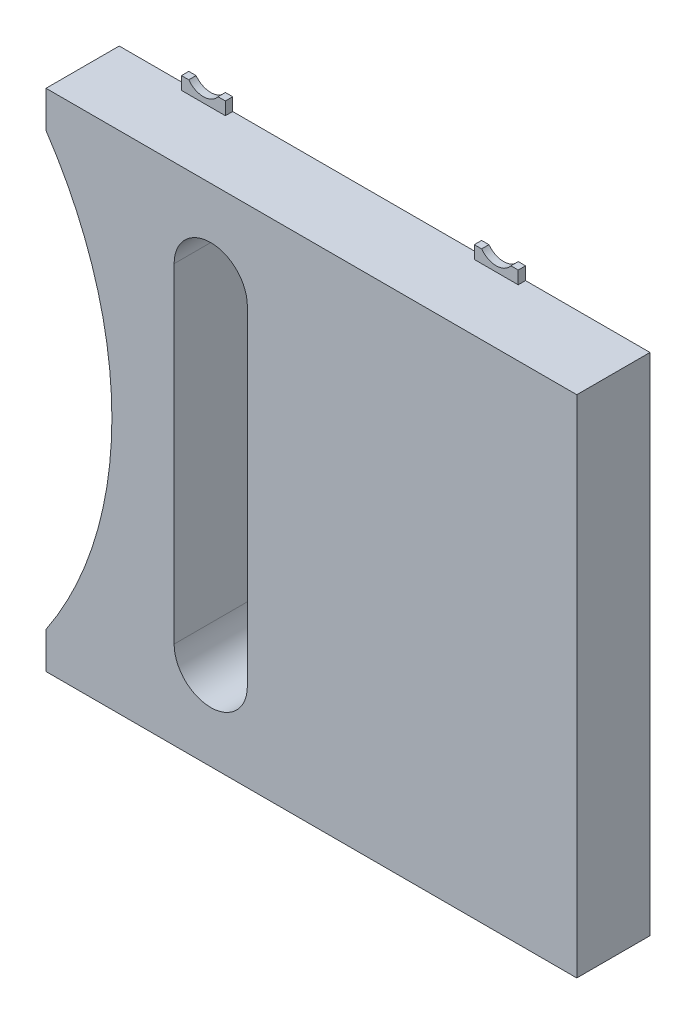
ISO-10303-21;
HEADER;
FILE_DESCRIPTION(('STEP AP214'),'2;1');
FILE_NAME('part.step','',(''),(''),'','','');
FILE_SCHEMA(('AUTOMOTIVE_DESIGN { 1 0 10303 214 1 1 1 1 }'));
ENDSEC;
DATA;
#1=APPLICATION_CONTEXT('core data for automotive mechanical design processes');
#2=APPLICATION_PROTOCOL_DEFINITION('international standard','automotive_design',2000,#1);
#3=PRODUCT_CONTEXT('',#1,'mechanical');
#4=PRODUCT('Part','Part','',(#3));
#5=PRODUCT_RELATED_PRODUCT_CATEGORY('part','',(#4));
#6=PRODUCT_DEFINITION_FORMATION('','',#4);
#7=PRODUCT_DEFINITION_CONTEXT('part definition',#1,'design');
#8=PRODUCT_DEFINITION('design','',#6,#7);
#9=PRODUCT_DEFINITION_SHAPE('','',#8);
#10=(LENGTH_UNIT() NAMED_UNIT(*) SI_UNIT(.MILLI.,.METRE.));
#11=(NAMED_UNIT(*) PLANE_ANGLE_UNIT() SI_UNIT($,.RADIAN.));
#12=(NAMED_UNIT(*) SI_UNIT($,.STERADIAN.) SOLID_ANGLE_UNIT());
#13=UNCERTAINTY_MEASURE_WITH_UNIT(LENGTH_MEASURE(1.E-05),#10,'distance_accuracy_value','');
#14=(GEOMETRIC_REPRESENTATION_CONTEXT(3) GLOBAL_UNCERTAINTY_ASSIGNED_CONTEXT((#13)) GLOBAL_UNIT_ASSIGNED_CONTEXT((#10,
#11,#12)) REPRESENTATION_CONTEXT('',''));
#15=CARTESIAN_POINT('',(0.,0.,0.));
#16=DIRECTION('',(0.,0.,1.));
#17=DIRECTION('',(1.,0.,0.));
#18=AXIS2_PLACEMENT_3D('',#15,#16,#17);
#19=CARTESIAN_POINT('',(-7.25,-6.9,2.));
#20=DIRECTION('',(0.,1.,0.));
#21=DIRECTION('',(0.,0.,1.));
#22=AXIS2_PLACEMENT_3D('',#19,#20,#21);
#23=PLANE('',#22);
#24=DIRECTION('',(0.,0.,-1.));
#25=VECTOR('',#24,1.);
#26=CARTESIAN_POINT('',(-4.15,-6.9,0.2));
#27=LINE('',#26,#25);
#28=CARTESIAN_POINT('',(-4.15,-6.9,0.2));
#29=VERTEX_POINT('',#28);
#30=CARTESIAN_POINT('',(-4.15,-6.9,0.));
#31=VERTEX_POINT('',#30);
#32=EDGE_CURVE('E285',#29,#31,#27,.T.);
#33=ORIENTED_EDGE('',*,*,#32,.T.);
#34=DIRECTION('',(1.,0.,0.));
#35=VECTOR('',#34,1.);
#36=CARTESIAN_POINT('',(-7.25,-6.9,0.));
#37=LINE('',#36,#35);
#38=CARTESIAN_POINT('',(2.65,-6.9,0.));
#39=VERTEX_POINT('',#38);
#40=EDGE_CURVE('E475',#31,#39,#37,.T.);
#41=ORIENTED_EDGE('',*,*,#40,.T.);
#42=DIRECTION('',(0.,0.,-1.));
#43=VECTOR('',#42,1.);
#44=CARTESIAN_POINT('',(2.65,-6.9,0.2));
#45=LINE('',#44,#43);
#46=CARTESIAN_POINT('',(2.65,-6.9,0.2));
#47=VERTEX_POINT('',#46);
#48=EDGE_CURVE('E315',#47,#39,#45,.T.);
#49=ORIENTED_EDGE('',*,*,#48,.F.);
#50=DIRECTION('',(-1.,0.,0.));
#51=VECTOR('',#50,1.);
#52=CARTESIAN_POINT('',(3.85,-6.9,0.2));
#53=LINE('',#52,#51);
#54=CARTESIAN_POINT('',(3.85,-6.9,0.2));
#55=VERTEX_POINT('',#54);
#56=EDGE_CURVE('E297',#55,#47,#53,.T.);
#57=ORIENTED_EDGE('',*,*,#56,.F.);
#58=DIRECTION('',(0.,0.,-1.));
#59=VECTOR('',#58,1.);
#60=CARTESIAN_POINT('',(3.85,-6.9,0.2));
#61=LINE('',#60,#59);
#62=CARTESIAN_POINT('',(3.85,-6.9,0.));
#63=VERTEX_POINT('',#62);
#64=EDGE_CURVE('E318',#55,#63,#61,.T.);
#65=ORIENTED_EDGE('',*,*,#64,.T.);
#66=CARTESIAN_POINT('',(7.25,-6.9,0.));
#67=VERTEX_POINT('',#66);
#68=EDGE_CURVE('E473',#63,#67,#37,.T.);
#69=ORIENTED_EDGE('',*,*,#68,.T.);
#70=DIRECTION('',(0.,0.,-1.));
#71=VECTOR('',#70,1.);
#72=CARTESIAN_POINT('',(7.25,-6.9,2.));
#73=LINE('',#72,#71);
#74=CARTESIAN_POINT('',(7.25,-6.9,2.));
#75=VERTEX_POINT('',#74);
#76=EDGE_CURVE('E460',#75,#67,#73,.T.);
#77=ORIENTED_EDGE('',*,*,#76,.F.);
#78=DIRECTION('',(1.,0.,0.));
#79=VECTOR('',#78,1.);
#80=CARTESIAN_POINT('',(-7.25,-6.9,2.));
#81=LINE('',#80,#79);
#82=CARTESIAN_POINT('',(-7.25,-6.9,2.));
#83=VERTEX_POINT('',#82);
#84=EDGE_CURVE('E458',#83,#75,#81,.T.);
#85=ORIENTED_EDGE('',*,*,#84,.F.);
#86=DIRECTION('',(0.,0.,-1.));
#87=VECTOR('',#86,1.);
#88=CARTESIAN_POINT('',(-7.25,-6.9,2.));
#89=LINE('',#88,#87);
#90=CARTESIAN_POINT('',(-7.25,-6.9,0.));
#91=VERTEX_POINT('',#90);
#92=EDGE_CURVE('E478',#83,#91,#89,.T.);
#93=ORIENTED_EDGE('',*,*,#92,.T.);
#94=CARTESIAN_POINT('',(-5.35,-6.9,0.));
#95=VERTEX_POINT('',#94);
#96=EDGE_CURVE('E450',#91,#95,#37,.T.);
#97=ORIENTED_EDGE('',*,*,#96,.T.);
#98=DIRECTION('',(0.,0.,-1.));
#99=VECTOR('',#98,1.);
#100=CARTESIAN_POINT('',(-5.35,-6.9,0.2));
#101=LINE('',#100,#99);
#102=CARTESIAN_POINT('',(-5.35,-6.9,0.2));
#103=VERTEX_POINT('',#102);
#104=EDGE_CURVE('E50',#103,#95,#101,.T.);
#105=ORIENTED_EDGE('',*,*,#104,.F.);
#106=DIRECTION('',(-1.,0.,0.));
#107=VECTOR('',#106,1.);
#108=CARTESIAN_POINT('',(-5.35,-6.9,0.2));
#109=LINE('',#108,#107);
#110=EDGE_CURVE('E54',#29,#103,#109,.T.);
#111=ORIENTED_EDGE('',*,*,#110,.F.);
#112=EDGE_LOOP('',(#33,#41,#49,#57,#65,#69,#77,#85,#93,#97,#105,#111));
#113=FACE_BOUND('',#112,.T.);
#114=ADVANCED_FACE('F35',(#113),#23,.F.);
#115=CARTESIAN_POINT('',(-7.25,6.9,2.));
#116=DIRECTION('',(0.,-1.,0.));
#117=DIRECTION('',(0.,0.,-1.));
#118=AXIS2_PLACEMENT_3D('',#115,#116,#117);
#119=PLANE('',#118);
#120=DIRECTION('',(0.,0.,-1.));
#121=VECTOR('',#120,1.);
#122=CARTESIAN_POINT('',(2.65,6.9,0.2));
#123=LINE('',#122,#121);
#124=CARTESIAN_POINT('',(2.65,6.9,0.2));
#125=VERTEX_POINT('',#124);
#126=CARTESIAN_POINT('',(2.65,6.9,0.));
#127=VERTEX_POINT('',#126);
#128=EDGE_CURVE('E363',#125,#127,#123,.T.);
#129=ORIENTED_EDGE('',*,*,#128,.T.);
#130=DIRECTION('',(-1.,0.,0.));
#131=VECTOR('',#130,1.);
#132=CARTESIAN_POINT('',(-7.25,6.9,0.));
#133=LINE('',#132,#131);
#134=CARTESIAN_POINT('',(-4.15,6.9,0.));
#135=VERTEX_POINT('',#134);
#136=EDGE_CURVE('E467',#127,#135,#133,.T.);
#137=ORIENTED_EDGE('',*,*,#136,.T.);
#138=DIRECTION('',(0.,0.,-1.));
#139=VECTOR('',#138,1.);
#140=CARTESIAN_POINT('',(-4.15,6.9,0.2));
#141=LINE('',#140,#139);
#142=CARTESIAN_POINT('',(-4.15,6.9,0.2));
#143=VERTEX_POINT('',#142);
#144=EDGE_CURVE('E402',#143,#135,#141,.T.);
#145=ORIENTED_EDGE('',*,*,#144,.F.);
#146=DIRECTION('',(1.,0.,0.));
#147=VECTOR('',#146,1.);
#148=CARTESIAN_POINT('',(-5.35,6.9,0.2));
#149=LINE('',#148,#147);
#150=CARTESIAN_POINT('',(-5.35,6.9,0.2));
#151=VERTEX_POINT('',#150);
#152=EDGE_CURVE('E381',#151,#143,#149,.T.);
#153=ORIENTED_EDGE('',*,*,#152,.F.);
#154=DIRECTION('',(0.,0.,-1.));
#155=VECTOR('',#154,1.);
#156=CARTESIAN_POINT('',(-5.35,6.9,0.2));
#157=LINE('',#156,#155);
#158=CARTESIAN_POINT('',(-5.35,6.9,0.));
#159=VERTEX_POINT('',#158);
#160=EDGE_CURVE('E405',#151,#159,#157,.T.);
#161=ORIENTED_EDGE('',*,*,#160,.T.);
#162=CARTESIAN_POINT('',(-7.25,6.9,0.));
#163=VERTEX_POINT('',#162);
#164=EDGE_CURVE('E463',#159,#163,#133,.T.);
#165=ORIENTED_EDGE('',*,*,#164,.T.);
#166=DIRECTION('',(0.,0.,-1.));
#167=VECTOR('',#166,1.);
#168=CARTESIAN_POINT('',(-7.25,6.9,2.));
#169=LINE('',#168,#167);
#170=CARTESIAN_POINT('',(-7.25,6.9,2.));
#171=VERTEX_POINT('',#170);
#172=EDGE_CURVE('E43',#171,#163,#169,.T.);
#173=ORIENTED_EDGE('',*,*,#172,.F.);
#174=DIRECTION('',(-1.,0.,0.));
#175=VECTOR('',#174,1.);
#176=CARTESIAN_POINT('',(-7.25,6.9,2.));
#177=LINE('',#176,#175);
#178=CARTESIAN_POINT('',(7.25,6.9,2.));
#179=VERTEX_POINT('',#178);
#180=EDGE_CURVE('E449',#179,#171,#177,.T.);
#181=ORIENTED_EDGE('',*,*,#180,.F.);
#182=DIRECTION('',(0.,0.,-1.));
#183=VECTOR('',#182,1.);
#184=CARTESIAN_POINT('',(7.25,6.9,2.));
#185=LINE('',#184,#183);
#186=CARTESIAN_POINT('',(7.25,6.9,0.));
#187=VERTEX_POINT('',#186);
#188=EDGE_CURVE('E11',#179,#187,#185,.T.);
#189=ORIENTED_EDGE('',*,*,#188,.T.);
#190=CARTESIAN_POINT('',(3.85,6.9,0.));
#191=VERTEX_POINT('',#190);
#192=EDGE_CURVE('E464',#187,#191,#133,.T.);
#193=ORIENTED_EDGE('',*,*,#192,.T.);
#194=DIRECTION('',(0.,0.,-1.));
#195=VECTOR('',#194,1.);
#196=CARTESIAN_POINT('',(3.85,6.9,0.2));
#197=LINE('',#196,#195);
#198=CARTESIAN_POINT('',(3.85,6.9,0.2));
#199=VERTEX_POINT('',#198);
#200=EDGE_CURVE('E360',#199,#191,#197,.T.);
#201=ORIENTED_EDGE('',*,*,#200,.F.);
#202=DIRECTION('',(1.,0.,0.));
#203=VECTOR('',#202,1.);
#204=CARTESIAN_POINT('',(3.85,6.9,0.2));
#205=LINE('',#204,#203);
#206=EDGE_CURVE('E337',#125,#199,#205,.T.);
#207=ORIENTED_EDGE('',*,*,#206,.F.);
#208=EDGE_LOOP('',(#129,#137,#145,#153,#161,#165,#173,#181,#189,#193,#201,#207));
#209=FACE_BOUND('',#208,.T.);
#210=ADVANCED_FACE('F518',(#209),#119,.F.);
#211=CARTESIAN_POINT('',(-16.0194444444445,0.,2.));
#212=DIRECTION('',(0.,0.,-1.));
#213=DIRECTION('',(-1.,0.,0.));
#214=AXIS2_PLACEMENT_3D('',#211,#212,#213);
#215=PLANE('',#214);
#216=DIRECTION('',(0.,1.,0.));
#217=VECTOR('',#216,1.);
#218=CARTESIAN_POINT('',(7.25,6.9,2.));
#219=LINE('',#218,#217);
#220=EDGE_CURVE('E446',#75,#179,#219,.T.);
#221=ORIENTED_EDGE('',*,*,#220,.T.);
#222=ORIENTED_EDGE('',*,*,#180,.T.);
#223=DIRECTION('',(0.,-1.,0.));
#224=VECTOR('',#223,1.);
#225=CARTESIAN_POINT('',(-7.25,6.9,2.));
#226=LINE('',#225,#224);
#227=CARTESIAN_POINT('',(-7.25,5.9,2.));
#228=VERTEX_POINT('',#227);
#229=EDGE_CURVE('E452',#171,#228,#226,.T.);
#230=ORIENTED_EDGE('',*,*,#229,.T.);
#231=CARTESIAN_POINT('',(-16.0194444444445,0.,2.));
#232=DIRECTION('',(0.,0.,-1.));
#233=DIRECTION('',(-1.,0.,0.));
#234=AXIS2_PLACEMENT_3D('',#231,#232,#233);
#235=CIRCLE('',#234,10.5694444444445);
#236=CARTESIAN_POINT('',(-7.25,-5.9,2.));
#237=VERTEX_POINT('',#236);
#238=EDGE_CURVE('E454',#228,#237,#235,.T.);
#239=ORIENTED_EDGE('',*,*,#238,.T.);
#240=DIRECTION('',(0.,-1.,0.));
#241=VECTOR('',#240,1.);
#242=CARTESIAN_POINT('',(-7.25,-6.9,2.));
#243=LINE('',#242,#241);
#244=EDGE_CURVE('E456',#237,#83,#243,.T.);
#245=ORIENTED_EDGE('',*,*,#244,.T.);
#246=ORIENTED_EDGE('',*,*,#84,.T.);
#247=EDGE_LOOP('',(#221,#222,#230,#239,#245,#246));
#248=FACE_BOUND('',#247,.T.);
#249=CARTESIAN_POINT('',(-2.75,-4.5,2.));
#250=DIRECTION('',(0.,0.,1.));
#251=DIRECTION('',(1.,0.,0.));
#252=AXIS2_PLACEMENT_3D('',#249,#250,#251);
#253=CIRCLE('',#252,1.);
#254=CARTESIAN_POINT('',(-3.75,-4.5,2.));
#255=VERTEX_POINT('',#254);
#256=CARTESIAN_POINT('',(-1.75,-4.5,2.));
#257=VERTEX_POINT('',#256);
#258=EDGE_CURVE('E415',#255,#257,#253,.T.);
#259=ORIENTED_EDGE('',*,*,#258,.F.);
#260=DIRECTION('',(0.,-1.,0.));
#261=VECTOR('',#260,1.);
#262=CARTESIAN_POINT('',(-3.75,-4.5,2.));
#263=LINE('',#262,#261);
#264=CARTESIAN_POINT('',(-3.75,4.5,2.));
#265=VERTEX_POINT('',#264);
#266=EDGE_CURVE('E423',#265,#255,#263,.T.);
#267=ORIENTED_EDGE('',*,*,#266,.F.);
#268=CARTESIAN_POINT('',(-2.75,4.5,2.));
#269=DIRECTION('',(0.,0.,1.));
#270=DIRECTION('',(1.,0.,0.));
#271=AXIS2_PLACEMENT_3D('',#268,#269,#270);
#272=CIRCLE('',#271,1.);
#273=CARTESIAN_POINT('',(-1.75,4.5,2.));
#274=VERTEX_POINT('',#273);
#275=EDGE_CURVE('E420',#274,#265,#272,.T.);
#276=ORIENTED_EDGE('',*,*,#275,.F.);
#277=DIRECTION('',(0.,1.,0.));
#278=VECTOR('',#277,1.);
#279=CARTESIAN_POINT('',(-1.75,-4.5,2.));
#280=LINE('',#279,#278);
#281=EDGE_CURVE('E417',#257,#274,#280,.T.);
#282=ORIENTED_EDGE('',*,*,#281,.F.);
#283=EDGE_LOOP('',(#259,#267,#276,#282));
#284=FACE_BOUND('',#283,.T.);
#285=ADVANCED_FACE('F513',(#248,#284),#215,.F.);
#286=CARTESIAN_POINT('',(-16.0194444444445,0.,0.));
#287=DIRECTION('',(0.,0.,-1.));
#288=DIRECTION('',(-1.,0.,0.));
#289=AXIS2_PLACEMENT_3D('',#286,#287,#288);
#290=PLANE('',#289);
#291=DIRECTION('',(0.,1.,0.));
#292=VECTOR('',#291,1.);
#293=CARTESIAN_POINT('',(7.25,6.9,0.));
#294=LINE('',#293,#292);
#295=EDGE_CURVE('E445',#67,#187,#294,.T.);
#296=ORIENTED_EDGE('',*,*,#295,.F.);
#297=ORIENTED_EDGE('',*,*,#68,.F.);
#298=DIRECTION('',(0.,1.,0.));
#299=VECTOR('',#298,1.);
#300=CARTESIAN_POINT('',(3.85,-7.25,0.));
#301=LINE('',#300,#299);
#302=CARTESIAN_POINT('',(3.85,-7.25,0.));
#303=VERTEX_POINT('',#302);
#304=EDGE_CURVE('E305',#303,#63,#301,.T.);
#305=ORIENTED_EDGE('',*,*,#304,.F.);
#306=DIRECTION('',(1.,0.,0.));
#307=VECTOR('',#306,1.);
#308=CARTESIAN_POINT('',(3.65,-7.25,0.));
#309=LINE('',#308,#307);
#310=CARTESIAN_POINT('',(3.65,-7.25,0.));
#311=VERTEX_POINT('',#310);
#312=EDGE_CURVE('E283',#311,#303,#309,.T.);
#313=ORIENTED_EDGE('',*,*,#312,.F.);
#314=CARTESIAN_POINT('',(3.25,-7.54999999999999,0.));
#315=DIRECTION('',(0.,0.,-1.));
#316=DIRECTION('',(1.,0.,0.));
#317=AXIS2_PLACEMENT_3D('',#314,#315,#316);
#318=CIRCLE('',#317,0.499999999999998);
#319=CARTESIAN_POINT('',(2.85,-7.25,0.));
#320=VERTEX_POINT('',#319);
#321=EDGE_CURVE('E280',#320,#311,#318,.T.);
#322=ORIENTED_EDGE('',*,*,#321,.F.);
#323=DIRECTION('',(1.,0.,0.));
#324=VECTOR('',#323,1.);
#325=CARTESIAN_POINT('',(2.65,-7.25,0.));
#326=LINE('',#325,#324);
#327=CARTESIAN_POINT('',(2.65,-7.25,0.));
#328=VERTEX_POINT('',#327);
#329=EDGE_CURVE('E293',#328,#320,#326,.T.);
#330=ORIENTED_EDGE('',*,*,#329,.F.);
#331=DIRECTION('',(0.,-1.,0.));
#332=VECTOR('',#331,1.);
#333=CARTESIAN_POINT('',(2.65,-6.9,0.));
#334=LINE('',#333,#332);
#335=EDGE_CURVE('E307',#39,#328,#334,.T.);
#336=ORIENTED_EDGE('',*,*,#335,.F.);
#337=ORIENTED_EDGE('',*,*,#40,.F.);
#338=DIRECTION('',(0.,1.,0.));
#339=VECTOR('',#338,1.);
#340=CARTESIAN_POINT('',(-4.15,-6.9,0.));
#341=LINE('',#340,#339);
#342=CARTESIAN_POINT('',(-4.15,-7.25,0.));
#343=VERTEX_POINT('',#342);
#344=EDGE_CURVE('E817',#343,#31,#341,.T.);
#345=ORIENTED_EDGE('',*,*,#344,.F.);
#346=DIRECTION('',(1.,0.,0.));
#347=VECTOR('',#346,1.);
#348=CARTESIAN_POINT('',(-4.15,-7.25,0.));
#349=LINE('',#348,#347);
#350=CARTESIAN_POINT('',(-4.35,-7.25,0.));
#351=VERTEX_POINT('',#350);
#352=EDGE_CURVE('E815',#351,#343,#349,.T.);
#353=ORIENTED_EDGE('',*,*,#352,.F.);
#354=CARTESIAN_POINT('',(-4.75,-7.54999999999999,0.));
#355=DIRECTION('',(0.,0.,-1.));
#356=DIRECTION('',(-1.,0.,0.));
#357=AXIS2_PLACEMENT_3D('',#354,#355,#356);
#358=CIRCLE('',#357,0.499999999999998);
#359=CARTESIAN_POINT('',(-5.15000000000001,-7.25,0.));
#360=VERTEX_POINT('',#359);
#361=EDGE_CURVE('E279',#360,#351,#358,.T.);
#362=ORIENTED_EDGE('',*,*,#361,.F.);
#363=DIRECTION('',(1.,0.,0.));
#364=VECTOR('',#363,1.);
#365=CARTESIAN_POINT('',(-5.15000000000001,-7.25,0.));
#366=LINE('',#365,#364);
#367=CARTESIAN_POINT('',(-5.35,-7.25,0.));
#368=VERTEX_POINT('',#367);
#369=EDGE_CURVE('E275',#368,#360,#366,.T.);
#370=ORIENTED_EDGE('',*,*,#369,.F.);
#371=DIRECTION('',(0.,-1.,0.));
#372=VECTOR('',#371,1.);
#373=CARTESIAN_POINT('',(-5.35,-7.25,0.));
#374=LINE('',#373,#372);
#375=EDGE_CURVE('E811',#95,#368,#374,.T.);
#376=ORIENTED_EDGE('',*,*,#375,.F.);
#377=ORIENTED_EDGE('',*,*,#96,.F.);
#378=DIRECTION('',(0.,-1.,0.));
#379=VECTOR('',#378,1.);
#380=CARTESIAN_POINT('',(-7.25,-6.9,0.));
#381=LINE('',#380,#379);
#382=CARTESIAN_POINT('',(-7.25,-5.9,0.));
#383=VERTEX_POINT('',#382);
#384=EDGE_CURVE('E471',#383,#91,#381,.T.);
#385=ORIENTED_EDGE('',*,*,#384,.F.);
#386=CARTESIAN_POINT('',(-16.0194444444445,0.,0.));
#387=DIRECTION('',(0.,0.,-1.));
#388=DIRECTION('',(-1.,0.,0.));
#389=AXIS2_PLACEMENT_3D('',#386,#387,#388);
#390=CIRCLE('',#389,10.5694444444445);
#391=CARTESIAN_POINT('',(-7.25,5.9,0.));
#392=VERTEX_POINT('',#391);
#393=EDGE_CURVE('E469',#392,#383,#390,.T.);
#394=ORIENTED_EDGE('',*,*,#393,.F.);
#395=DIRECTION('',(0.,-1.,0.));
#396=VECTOR('',#395,1.);
#397=CARTESIAN_POINT('',(-7.25,6.9,0.));
#398=LINE('',#397,#396);
#399=EDGE_CURVE('E466',#163,#392,#398,.T.);
#400=ORIENTED_EDGE('',*,*,#399,.F.);
#401=ORIENTED_EDGE('',*,*,#164,.F.);
#402=DIRECTION('',(0.,-1.,0.));
#403=VECTOR('',#402,1.);
#404=CARTESIAN_POINT('',(-5.35,7.25,0.));
#405=LINE('',#404,#403);
#406=CARTESIAN_POINT('',(-5.35,7.25,0.));
#407=VERTEX_POINT('',#406);
#408=EDGE_CURVE('E392',#407,#159,#405,.T.);
#409=ORIENTED_EDGE('',*,*,#408,.F.);
#410=DIRECTION('',(-1.,0.,0.));
#411=VECTOR('',#410,1.);
#412=CARTESIAN_POINT('',(-5.15,7.25,0.));
#413=LINE('',#412,#411);
#414=CARTESIAN_POINT('',(-5.15,7.25,0.));
#415=VERTEX_POINT('',#414);
#416=EDGE_CURVE('E390',#415,#407,#413,.T.);
#417=ORIENTED_EDGE('',*,*,#416,.F.);
#418=CARTESIAN_POINT('',(-4.75,7.54999999999999,0.));
#419=DIRECTION('',(0.,0.,-1.));
#420=DIRECTION('',(1.,0.,0.));
#421=AXIS2_PLACEMENT_3D('',#418,#419,#420);
#422=CIRCLE('',#421,0.499999999999995);
#423=CARTESIAN_POINT('',(-4.35,7.25,0.));
#424=VERTEX_POINT('',#423);
#425=EDGE_CURVE('E372',#424,#415,#422,.T.);
#426=ORIENTED_EDGE('',*,*,#425,.F.);
#427=DIRECTION('',(-1.,0.,0.));
#428=VECTOR('',#427,1.);
#429=CARTESIAN_POINT('',(-4.15,7.25,0.));
#430=LINE('',#429,#428);
#431=CARTESIAN_POINT('',(-4.15,7.25,0.));
#432=VERTEX_POINT('',#431);
#433=EDGE_CURVE('E377',#432,#424,#430,.T.);
#434=ORIENTED_EDGE('',*,*,#433,.F.);
#435=DIRECTION('',(0.,1.,0.));
#436=VECTOR('',#435,1.);
#437=CARTESIAN_POINT('',(-4.15,6.9,0.));
#438=LINE('',#437,#436);
#439=EDGE_CURVE('E394',#135,#432,#438,.T.);
#440=ORIENTED_EDGE('',*,*,#439,.F.);
#441=ORIENTED_EDGE('',*,*,#136,.F.);
#442=DIRECTION('',(0.,-1.,0.));
#443=VECTOR('',#442,1.);
#444=CARTESIAN_POINT('',(2.65,6.9,0.));
#445=LINE('',#444,#443);
#446=CARTESIAN_POINT('',(2.65,7.25,0.));
#447=VERTEX_POINT('',#446);
#448=EDGE_CURVE('E349',#447,#127,#445,.T.);
#449=ORIENTED_EDGE('',*,*,#448,.F.);
#450=DIRECTION('',(-1.,0.,0.));
#451=VECTOR('',#450,1.);
#452=CARTESIAN_POINT('',(2.65,7.25,0.));
#453=LINE('',#452,#451);
#454=CARTESIAN_POINT('',(2.85,7.25,0.));
#455=VERTEX_POINT('',#454);
#456=EDGE_CURVE('E347',#455,#447,#453,.T.);
#457=ORIENTED_EDGE('',*,*,#456,.F.);
#458=CARTESIAN_POINT('',(3.25,7.54999999999999,0.));
#459=DIRECTION('',(0.,0.,-1.));
#460=DIRECTION('',(-1.,0.,0.));
#461=AXIS2_PLACEMENT_3D('',#458,#459,#460);
#462=CIRCLE('',#461,0.499999999999995);
#463=CARTESIAN_POINT('',(3.65,7.25,0.));
#464=VERTEX_POINT('',#463);
#465=EDGE_CURVE('E327',#464,#455,#462,.T.);
#466=ORIENTED_EDGE('',*,*,#465,.F.);
#467=DIRECTION('',(-1.,0.,0.));
#468=VECTOR('',#467,1.);
#469=CARTESIAN_POINT('',(3.65,7.25,0.));
#470=LINE('',#469,#468);
#471=CARTESIAN_POINT('',(3.85,7.25,0.));
#472=VERTEX_POINT('',#471);
#473=EDGE_CURVE('E332',#472,#464,#470,.T.);
#474=ORIENTED_EDGE('',*,*,#473,.F.);
#475=DIRECTION('',(0.,1.,0.));
#476=VECTOR('',#475,1.);
#477=CARTESIAN_POINT('',(3.85,7.25,0.));
#478=LINE('',#477,#476);
#479=EDGE_CURVE('E352',#191,#472,#478,.T.);
#480=ORIENTED_EDGE('',*,*,#479,.F.);
#481=ORIENTED_EDGE('',*,*,#192,.F.);
#482=EDGE_LOOP('',(#296,#297,#305,#313,#322,#330,#336,#337,#345,#353,#362,#370,#376,#377,#385,
#394,#400,#401,#409,#417,#426,#434,#440,#441,#449,#457,#466,#474,#480,#481));
#483=FACE_BOUND('',#482,.T.);
#484=DIRECTION('',(0.,-1.,0.));
#485=VECTOR('',#484,1.);
#486=CARTESIAN_POINT('',(-3.75,-4.5,0.));
#487=LINE('',#486,#485);
#488=CARTESIAN_POINT('',(-3.75,4.5,0.));
#489=VERTEX_POINT('',#488);
#490=CARTESIAN_POINT('',(-3.75,-4.5,0.));
#491=VERTEX_POINT('',#490);
#492=EDGE_CURVE('E418',#489,#491,#487,.T.);
#493=ORIENTED_EDGE('',*,*,#492,.T.);
#494=CARTESIAN_POINT('',(-2.75,-4.5,0.));
#495=DIRECTION('',(0.,0.,1.));
#496=DIRECTION('',(1.,0.,0.));
#497=AXIS2_PLACEMENT_3D('',#494,#495,#496);
#498=CIRCLE('',#497,1.);
#499=CARTESIAN_POINT('',(-1.75,-4.5,0.));
#500=VERTEX_POINT('',#499);
#501=EDGE_CURVE('E414',#491,#500,#498,.T.);
#502=ORIENTED_EDGE('',*,*,#501,.T.);
#503=DIRECTION('',(0.,1.,0.));
#504=VECTOR('',#503,1.);
#505=CARTESIAN_POINT('',(-1.75,-4.5,0.));
#506=LINE('',#505,#504);
#507=CARTESIAN_POINT('',(-1.75,4.5,0.));
#508=VERTEX_POINT('',#507);
#509=EDGE_CURVE('E428',#500,#508,#506,.T.);
#510=ORIENTED_EDGE('',*,*,#509,.T.);
#511=CARTESIAN_POINT('',(-2.75,4.5,0.));
#512=DIRECTION('',(0.,0.,1.));
#513=DIRECTION('',(1.,0.,0.));
#514=AXIS2_PLACEMENT_3D('',#511,#512,#513);
#515=CIRCLE('',#514,1.);
#516=EDGE_CURVE('E431',#508,#489,#515,.T.);
#517=ORIENTED_EDGE('',*,*,#516,.T.);
#518=EDGE_LOOP('',(#493,#502,#510,#517));
#519=FACE_BOUND('',#518,.T.);
#520=ADVANCED_FACE('F498',(#483,#519),#290,.T.);
#521=CARTESIAN_POINT('',(7.25,6.9,2.));
#522=DIRECTION('',(-1.,0.,0.));
#523=DIRECTION('',(0.,-1.,0.));
#524=AXIS2_PLACEMENT_3D('',#521,#522,#523);
#525=PLANE('',#524);
#526=ORIENTED_EDGE('',*,*,#295,.T.);
#527=ORIENTED_EDGE('',*,*,#188,.F.);
#528=ORIENTED_EDGE('',*,*,#220,.F.);
#529=ORIENTED_EDGE('',*,*,#76,.T.);
#530=EDGE_LOOP('',(#526,#527,#528,#529));
#531=FACE_BOUND('',#530,.T.);
#532=ADVANCED_FACE('F37',(#531),#525,.F.);
#533=CARTESIAN_POINT('',(-7.25,6.9,2.));
#534=DIRECTION('',(1.,0.,0.));
#535=DIRECTION('',(0.,1.,0.));
#536=AXIS2_PLACEMENT_3D('',#533,#534,#535);
#537=PLANE('',#536);
#538=ORIENTED_EDGE('',*,*,#399,.T.);
#539=DIRECTION('',(0.,0.,-1.));
#540=VECTOR('',#539,1.);
#541=CARTESIAN_POINT('',(-7.25,5.9,2.));
#542=LINE('',#541,#540);
#543=EDGE_CURVE('E484',#228,#392,#542,.T.);
#544=ORIENTED_EDGE('',*,*,#543,.F.);
#545=ORIENTED_EDGE('',*,*,#229,.F.);
#546=ORIENTED_EDGE('',*,*,#172,.T.);
#547=EDGE_LOOP('',(#538,#544,#545,#546));
#548=FACE_BOUND('',#547,.T.);
#549=ADVANCED_FACE('F491',(#548),#537,.F.);
#550=CARTESIAN_POINT('',(-16.0194444444445,0.,2.));
#551=DIRECTION('',(0.,0.,-1.));
#552=DIRECTION('',(-1.,0.,0.));
#553=AXIS2_PLACEMENT_3D('',#550,#551,#552);
#554=CYLINDRICAL_SURFACE('',#553,10.5694444444445);
#555=ORIENTED_EDGE('',*,*,#393,.T.);
#556=DIRECTION('',(0.,0.,-1.));
#557=VECTOR('',#556,1.);
#558=CARTESIAN_POINT('',(-7.25,-5.9,2.));
#559=LINE('',#558,#557);
#560=EDGE_CURVE('E481',#237,#383,#559,.T.);
#561=ORIENTED_EDGE('',*,*,#560,.F.);
#562=ORIENTED_EDGE('',*,*,#238,.F.);
#563=ORIENTED_EDGE('',*,*,#543,.T.);
#564=EDGE_LOOP('',(#555,#561,#562,#563));
#565=FACE_BOUND('',#564,.T.);
#566=ADVANCED_FACE('F505',(#565),#554,.F.);
#567=CARTESIAN_POINT('',(-7.25,-6.9,2.));
#568=DIRECTION('',(1.,0.,0.));
#569=DIRECTION('',(0.,1.,0.));
#570=AXIS2_PLACEMENT_3D('',#567,#568,#569);
#571=PLANE('',#570);
#572=ORIENTED_EDGE('',*,*,#384,.T.);
#573=ORIENTED_EDGE('',*,*,#92,.F.);
#574=ORIENTED_EDGE('',*,*,#244,.F.);
#575=ORIENTED_EDGE('',*,*,#560,.T.);
#576=EDGE_LOOP('',(#572,#573,#574,#575));
#577=FACE_BOUND('',#576,.T.);
#578=ADVANCED_FACE('F509',(#577),#571,.F.);
#579=CARTESIAN_POINT('',(-2.75,-4.5,2.));
#580=DIRECTION('',(0.,0.,-1.));
#581=DIRECTION('',(-1.,0.,0.));
#582=AXIS2_PLACEMENT_3D('',#579,#580,#581);
#583=CYLINDRICAL_SURFACE('',#582,1.);
#584=ORIENTED_EDGE('',*,*,#501,.F.);
#585=DIRECTION('',(0.,0.,-1.));
#586=VECTOR('',#585,1.);
#587=CARTESIAN_POINT('',(-3.75,-4.5,2.));
#588=LINE('',#587,#586);
#589=EDGE_CURVE('E425',#255,#491,#588,.T.);
#590=ORIENTED_EDGE('',*,*,#589,.F.);
#591=ORIENTED_EDGE('',*,*,#258,.T.);
#592=DIRECTION('',(0.,0.,-1.));
#593=VECTOR('',#592,1.);
#594=CARTESIAN_POINT('',(-1.75,-4.5,2.));
#595=LINE('',#594,#593);
#596=EDGE_CURVE('E442',#257,#500,#595,.T.);
#597=ORIENTED_EDGE('',*,*,#596,.T.);
#598=EDGE_LOOP('',(#584,#590,#591,#597));
#599=FACE_BOUND('',#598,.T.);
#600=ADVANCED_FACE('F590',(#599),#583,.F.);
#601=CARTESIAN_POINT('',(-1.75,-4.5,2.));
#602=DIRECTION('',(-1.,0.,0.));
#603=DIRECTION('',(0.,-1.,0.));
#604=AXIS2_PLACEMENT_3D('',#601,#602,#603);
#605=PLANE('',#604);
#606=ORIENTED_EDGE('',*,*,#509,.F.);
#607=ORIENTED_EDGE('',*,*,#596,.F.);
#608=ORIENTED_EDGE('',*,*,#281,.T.);
#609=DIRECTION('',(0.,0.,-1.));
#610=VECTOR('',#609,1.);
#611=CARTESIAN_POINT('',(-1.75,4.5,2.));
#612=LINE('',#611,#610);
#613=EDGE_CURVE('E440',#274,#508,#612,.T.);
#614=ORIENTED_EDGE('',*,*,#613,.T.);
#615=EDGE_LOOP('',(#606,#607,#608,#614));
#616=FACE_BOUND('',#615,.T.);
#617=ADVANCED_FACE('F608',(#616),#605,.T.);
#618=CARTESIAN_POINT('',(-2.75,4.5,2.));
#619=DIRECTION('',(0.,0.,-1.));
#620=DIRECTION('',(-1.,0.,0.));
#621=AXIS2_PLACEMENT_3D('',#618,#619,#620);
#622=CYLINDRICAL_SURFACE('',#621,1.);
#623=ORIENTED_EDGE('',*,*,#516,.F.);
#624=ORIENTED_EDGE('',*,*,#613,.F.);
#625=ORIENTED_EDGE('',*,*,#275,.T.);
#626=DIRECTION('',(0.,0.,-1.));
#627=VECTOR('',#626,1.);
#628=CARTESIAN_POINT('',(-3.75,4.5,2.));
#629=LINE('',#628,#627);
#630=EDGE_CURVE('E438',#265,#489,#629,.T.);
#631=ORIENTED_EDGE('',*,*,#630,.T.);
#632=EDGE_LOOP('',(#623,#624,#625,#631));
#633=FACE_BOUND('',#632,.T.);
#634=ADVANCED_FACE('F612',(#633),#622,.F.);
#635=CARTESIAN_POINT('',(-3.75,-4.5,2.));
#636=DIRECTION('',(1.,0.,0.));
#637=DIRECTION('',(0.,1.,0.));
#638=AXIS2_PLACEMENT_3D('',#635,#636,#637);
#639=PLANE('',#638);
#640=ORIENTED_EDGE('',*,*,#492,.F.);
#641=ORIENTED_EDGE('',*,*,#630,.F.);
#642=ORIENTED_EDGE('',*,*,#266,.T.);
#643=ORIENTED_EDGE('',*,*,#589,.T.);
#644=EDGE_LOOP('',(#640,#641,#642,#643));
#645=FACE_BOUND('',#644,.T.);
#646=ADVANCED_FACE('F616',(#645),#639,.T.);
#647=CARTESIAN_POINT('',(-4.75,7.54999999999999,0.2));
#648=DIRECTION('',(0.,0.,-1.));
#649=DIRECTION('',(-1.,0.,0.));
#650=AXIS2_PLACEMENT_3D('',#647,#648,#649);
#651=CYLINDRICAL_SURFACE('',#650,0.499999999999995);
#652=ORIENTED_EDGE('',*,*,#425,.T.);
#653=DIRECTION('',(0.,0.,-1.));
#654=VECTOR('',#653,1.);
#655=CARTESIAN_POINT('',(-5.15,7.25,0.2));
#656=LINE('',#655,#654);
#657=CARTESIAN_POINT('',(-5.15,7.25,0.2));
#658=VERTEX_POINT('',#657);
#659=EDGE_CURVE('E411',#658,#415,#656,.T.);
#660=ORIENTED_EDGE('',*,*,#659,.F.);
#661=CARTESIAN_POINT('',(-4.75,7.54999999999999,0.2));
#662=DIRECTION('',(0.,0.,-1.));
#663=DIRECTION('',(1.,0.,0.));
#664=AXIS2_PLACEMENT_3D('',#661,#662,#663);
#665=CIRCLE('',#664,0.499999999999995);
#666=CARTESIAN_POINT('',(-4.35,7.25,0.2));
#667=VERTEX_POINT('',#666);
#668=EDGE_CURVE('E373',#667,#658,#665,.T.);
#669=ORIENTED_EDGE('',*,*,#668,.F.);
#670=DIRECTION('',(0.,0.,-1.));
#671=VECTOR('',#670,1.);
#672=CARTESIAN_POINT('',(-4.35,7.25,0.2));
#673=LINE('',#672,#671);
#674=EDGE_CURVE('E387',#667,#424,#673,.T.);
#675=ORIENTED_EDGE('',*,*,#674,.T.);
#676=EDGE_LOOP('',(#652,#660,#669,#675));
#677=FACE_BOUND('',#676,.T.);
#678=ADVANCED_FACE('F558',(#677),#651,.F.);
#679=CARTESIAN_POINT('',(-5.15,7.25,0.2));
#680=DIRECTION('',(0.,-1.,0.));
#681=DIRECTION('',(0.,0.,-1.));
#682=AXIS2_PLACEMENT_3D('',#679,#680,#681);
#683=PLANE('',#682);
#684=ORIENTED_EDGE('',*,*,#416,.T.);
#685=DIRECTION('',(0.,0.,-1.));
#686=VECTOR('',#685,1.);
#687=CARTESIAN_POINT('',(-5.35,7.25,0.2));
#688=LINE('',#687,#686);
#689=CARTESIAN_POINT('',(-5.35,7.25,0.2));
#690=VERTEX_POINT('',#689);
#691=EDGE_CURVE('E408',#690,#407,#688,.T.);
#692=ORIENTED_EDGE('',*,*,#691,.F.);
#693=DIRECTION('',(-1.,0.,0.));
#694=VECTOR('',#693,1.);
#695=CARTESIAN_POINT('',(-5.15,7.25,0.2));
#696=LINE('',#695,#694);
#697=EDGE_CURVE('E376',#658,#690,#696,.T.);
#698=ORIENTED_EDGE('',*,*,#697,.F.);
#699=ORIENTED_EDGE('',*,*,#659,.T.);
#700=EDGE_LOOP('',(#684,#692,#698,#699));
#701=FACE_BOUND('',#700,.T.);
#702=ADVANCED_FACE('F555',(#701),#683,.F.);
#703=CARTESIAN_POINT('',(-5.35,7.25,0.2));
#704=DIRECTION('',(1.,0.,0.));
#705=DIRECTION('',(0.,1.,0.));
#706=AXIS2_PLACEMENT_3D('',#703,#704,#705);
#707=PLANE('',#706);
#708=ORIENTED_EDGE('',*,*,#408,.T.);
#709=ORIENTED_EDGE('',*,*,#160,.F.);
#710=DIRECTION('',(0.,-1.,0.));
#711=VECTOR('',#710,1.);
#712=CARTESIAN_POINT('',(-5.35,7.25,0.2));
#713=LINE('',#712,#711);
#714=EDGE_CURVE('E379',#690,#151,#713,.T.);
#715=ORIENTED_EDGE('',*,*,#714,.F.);
#716=ORIENTED_EDGE('',*,*,#691,.T.);
#717=EDGE_LOOP('',(#708,#709,#715,#716));
#718=FACE_BOUND('',#717,.T.);
#719=ADVANCED_FACE('F550',(#718),#707,.F.);
#720=CARTESIAN_POINT('',(-4.15,6.9,0.2));
#721=DIRECTION('',(-1.,0.,0.));
#722=DIRECTION('',(0.,-1.,0.));
#723=AXIS2_PLACEMENT_3D('',#720,#721,#722);
#724=PLANE('',#723);
#725=ORIENTED_EDGE('',*,*,#439,.T.);
#726=DIRECTION('',(0.,0.,-1.));
#727=VECTOR('',#726,1.);
#728=CARTESIAN_POINT('',(-4.15,7.25,0.2));
#729=LINE('',#728,#727);
#730=CARTESIAN_POINT('',(-4.15,7.25,0.2));
#731=VERTEX_POINT('',#730);
#732=EDGE_CURVE('E399',#731,#432,#729,.T.);
#733=ORIENTED_EDGE('',*,*,#732,.F.);
#734=DIRECTION('',(0.,1.,0.));
#735=VECTOR('',#734,1.);
#736=CARTESIAN_POINT('',(-4.15,6.9,0.2));
#737=LINE('',#736,#735);
#738=EDGE_CURVE('E383',#143,#731,#737,.T.);
#739=ORIENTED_EDGE('',*,*,#738,.F.);
#740=ORIENTED_EDGE('',*,*,#144,.T.);
#741=EDGE_LOOP('',(#725,#733,#739,#740));
#742=FACE_BOUND('',#741,.T.);
#743=ADVANCED_FACE('F566',(#742),#724,.F.);
#744=CARTESIAN_POINT('',(-4.15,7.25,0.2));
#745=DIRECTION('',(0.,-1.,0.));
#746=DIRECTION('',(0.,0.,-1.));
#747=AXIS2_PLACEMENT_3D('',#744,#745,#746);
#748=PLANE('',#747);
#749=ORIENTED_EDGE('',*,*,#433,.T.);
#750=ORIENTED_EDGE('',*,*,#674,.F.);
#751=DIRECTION('',(-1.,0.,0.));
#752=VECTOR('',#751,1.);
#753=CARTESIAN_POINT('',(-4.15,7.25,0.2));
#754=LINE('',#753,#752);
#755=EDGE_CURVE('E385',#731,#667,#754,.T.);
#756=ORIENTED_EDGE('',*,*,#755,.F.);
#757=ORIENTED_EDGE('',*,*,#732,.T.);
#758=EDGE_LOOP('',(#749,#750,#756,#757));
#759=FACE_BOUND('',#758,.T.);
#760=ADVANCED_FACE('F562',(#759),#748,.F.);
#761=CARTESIAN_POINT('',(-4.75,7.54999999999999,0.2));
#762=DIRECTION('',(0.,0.,1.));
#763=DIRECTION('',(1.,0.,0.));
#764=AXIS2_PLACEMENT_3D('',#761,#762,#763);
#765=PLANE('',#764);
#766=ORIENTED_EDGE('',*,*,#668,.T.);
#767=ORIENTED_EDGE('',*,*,#697,.T.);
#768=ORIENTED_EDGE('',*,*,#714,.T.);
#769=ORIENTED_EDGE('',*,*,#152,.T.);
#770=ORIENTED_EDGE('',*,*,#738,.T.);
#771=ORIENTED_EDGE('',*,*,#755,.T.);
#772=EDGE_LOOP('',(#766,#767,#768,#769,#770,#771));
#773=FACE_BOUND('',#772,.T.);
#774=ADVANCED_FACE('F568',(#773),#765,.T.);
#775=CARTESIAN_POINT('',(3.25,7.54999999999999,0.2));
#776=DIRECTION('',(0.,0.,-1.));
#777=DIRECTION('',(-1.,0.,0.));
#778=AXIS2_PLACEMENT_3D('',#775,#776,#777);
#779=CYLINDRICAL_SURFACE('',#778,0.499999999999995);
#780=ORIENTED_EDGE('',*,*,#465,.T.);
#781=DIRECTION('',(0.,0.,-1.));
#782=VECTOR('',#781,1.);
#783=CARTESIAN_POINT('',(2.85,7.25,0.2));
#784=LINE('',#783,#782);
#785=CARTESIAN_POINT('',(2.85,7.25,0.2));
#786=VERTEX_POINT('',#785);
#787=EDGE_CURVE('E369',#786,#455,#784,.T.);
#788=ORIENTED_EDGE('',*,*,#787,.F.);
#789=CARTESIAN_POINT('',(3.25,7.54999999999999,0.2));
#790=DIRECTION('',(0.,0.,-1.));
#791=DIRECTION('',(-1.,0.,0.));
#792=AXIS2_PLACEMENT_3D('',#789,#790,#791);
#793=CIRCLE('',#792,0.499999999999995);
#794=CARTESIAN_POINT('',(3.65,7.25,0.2));
#795=VERTEX_POINT('',#794);
#796=EDGE_CURVE('E328',#795,#786,#793,.T.);
#797=ORIENTED_EDGE('',*,*,#796,.F.);
#798=DIRECTION('',(0.,0.,-1.));
#799=VECTOR('',#798,1.);
#800=CARTESIAN_POINT('',(3.65,7.25,0.2));
#801=LINE('',#800,#799);
#802=EDGE_CURVE('E344',#795,#464,#801,.T.);
#803=ORIENTED_EDGE('',*,*,#802,.T.);
#804=EDGE_LOOP('',(#780,#788,#797,#803));
#805=FACE_BOUND('',#804,.T.);
#806=ADVANCED_FACE('F570',(#805),#779,.F.);
#807=CARTESIAN_POINT('',(2.65,7.25,0.2));
#808=DIRECTION('',(0.,-1.,0.));
#809=DIRECTION('',(0.,0.,-1.));
#810=AXIS2_PLACEMENT_3D('',#807,#808,#809);
#811=PLANE('',#810);
#812=ORIENTED_EDGE('',*,*,#456,.T.);
#813=DIRECTION('',(0.,0.,-1.));
#814=VECTOR('',#813,1.);
#815=CARTESIAN_POINT('',(2.65,7.25,0.2));
#816=LINE('',#815,#814);
#817=CARTESIAN_POINT('',(2.65,7.25,0.2));
#818=VERTEX_POINT('',#817);
#819=EDGE_CURVE('E366',#818,#447,#816,.T.);
#820=ORIENTED_EDGE('',*,*,#819,.F.);
#821=DIRECTION('',(-1.,0.,0.));
#822=VECTOR('',#821,1.);
#823=CARTESIAN_POINT('',(2.65,7.25,0.2));
#824=LINE('',#823,#822);
#825=EDGE_CURVE('E331',#786,#818,#824,.T.);
#826=ORIENTED_EDGE('',*,*,#825,.F.);
#827=ORIENTED_EDGE('',*,*,#787,.T.);
#828=EDGE_LOOP('',(#812,#820,#826,#827));
#829=FACE_BOUND('',#828,.T.);
#830=ADVANCED_FACE('F576',(#829),#811,.F.);
#831=CARTESIAN_POINT('',(2.65,6.9,0.2));
#832=DIRECTION('',(1.,0.,0.));
#833=DIRECTION('',(0.,1.,0.));
#834=AXIS2_PLACEMENT_3D('',#831,#832,#833);
#835=PLANE('',#834);
#836=ORIENTED_EDGE('',*,*,#448,.T.);
#837=ORIENTED_EDGE('',*,*,#128,.F.);
#838=DIRECTION('',(0.,-1.,0.));
#839=VECTOR('',#838,1.);
#840=CARTESIAN_POINT('',(2.65,6.9,0.2));
#841=LINE('',#840,#839);
#842=EDGE_CURVE('E334',#818,#125,#841,.T.);
#843=ORIENTED_EDGE('',*,*,#842,.F.);
#844=ORIENTED_EDGE('',*,*,#819,.T.);
#845=EDGE_LOOP('',(#836,#837,#843,#844));
#846=FACE_BOUND('',#845,.T.);
#847=ADVANCED_FACE('F542',(#846),#835,.F.);
#848=CARTESIAN_POINT('',(3.85,7.25,0.2));
#849=DIRECTION('',(-1.,0.,0.));
#850=DIRECTION('',(0.,-1.,0.));
#851=AXIS2_PLACEMENT_3D('',#848,#849,#850);
#852=PLANE('',#851);
#853=ORIENTED_EDGE('',*,*,#479,.T.);
#854=DIRECTION('',(0.,0.,-1.));
#855=VECTOR('',#854,1.);
#856=CARTESIAN_POINT('',(3.85,7.25,0.2));
#857=LINE('',#856,#855);
#858=CARTESIAN_POINT('',(3.85,7.25,0.2));
#859=VERTEX_POINT('',#858);
#860=EDGE_CURVE('E357',#859,#472,#857,.T.);
#861=ORIENTED_EDGE('',*,*,#860,.F.);
#862=DIRECTION('',(0.,1.,0.));
#863=VECTOR('',#862,1.);
#864=CARTESIAN_POINT('',(3.85,7.25,0.2));
#865=LINE('',#864,#863);
#866=EDGE_CURVE('E340',#199,#859,#865,.T.);
#867=ORIENTED_EDGE('',*,*,#866,.F.);
#868=ORIENTED_EDGE('',*,*,#200,.T.);
#869=EDGE_LOOP('',(#853,#861,#867,#868));
#870=FACE_BOUND('',#869,.T.);
#871=ADVANCED_FACE('F527',(#870),#852,.F.);
#872=CARTESIAN_POINT('',(3.65,7.25,0.2));
#873=DIRECTION('',(0.,-1.,0.));
#874=DIRECTION('',(0.,0.,-1.));
#875=AXIS2_PLACEMENT_3D('',#872,#873,#874);
#876=PLANE('',#875);
#877=ORIENTED_EDGE('',*,*,#473,.T.);
#878=ORIENTED_EDGE('',*,*,#802,.F.);
#879=DIRECTION('',(-1.,0.,0.));
#880=VECTOR('',#879,1.);
#881=CARTESIAN_POINT('',(3.65,7.25,0.2));
#882=LINE('',#881,#880);
#883=EDGE_CURVE('E342',#859,#795,#882,.T.);
#884=ORIENTED_EDGE('',*,*,#883,.F.);
#885=ORIENTED_EDGE('',*,*,#860,.T.);
#886=EDGE_LOOP('',(#877,#878,#884,#885));
#887=FACE_BOUND('',#886,.T.);
#888=ADVANCED_FACE('F531',(#887),#876,.F.);
#889=CARTESIAN_POINT('',(3.25,7.54999999999999,0.2));
#890=DIRECTION('',(0.,0.,-1.));
#891=DIRECTION('',(-1.,0.,0.));
#892=AXIS2_PLACEMENT_3D('',#889,#890,#891);
#893=PLANE('',#892);
#894=ORIENTED_EDGE('',*,*,#796,.T.);
#895=ORIENTED_EDGE('',*,*,#825,.T.);
#896=ORIENTED_EDGE('',*,*,#842,.T.);
#897=ORIENTED_EDGE('',*,*,#206,.T.);
#898=ORIENTED_EDGE('',*,*,#866,.T.);
#899=ORIENTED_EDGE('',*,*,#883,.T.);
#900=EDGE_LOOP('',(#894,#895,#896,#897,#898,#899));
#901=FACE_BOUND('',#900,.T.);
#902=ADVANCED_FACE('F535',(#901),#893,.F.);
#903=CARTESIAN_POINT('',(3.25,-7.54999999999999,0.2));
#904=DIRECTION('',(0.,0.,-1.));
#905=DIRECTION('',(-1.,0.,0.));
#906=AXIS2_PLACEMENT_3D('',#903,#904,#905);
#907=CYLINDRICAL_SURFACE('',#906,0.499999999999998);
#908=ORIENTED_EDGE('',*,*,#321,.T.);
#909=DIRECTION('',(0.,0.,-1.));
#910=VECTOR('',#909,1.);
#911=CARTESIAN_POINT('',(3.65,-7.25,0.2));
#912=LINE('',#911,#910);
#913=CARTESIAN_POINT('',(3.65,-7.25,0.2));
#914=VERTEX_POINT('',#913);
#915=EDGE_CURVE('E324',#914,#311,#912,.T.);
#916=ORIENTED_EDGE('',*,*,#915,.F.);
#917=CARTESIAN_POINT('',(3.25,-7.54999999999999,0.2));
#918=DIRECTION('',(0.,0.,-1.));
#919=DIRECTION('',(1.,0.,0.));
#920=AXIS2_PLACEMENT_3D('',#917,#918,#919);
#921=CIRCLE('',#920,0.499999999999998);
#922=CARTESIAN_POINT('',(2.85,-7.25,0.2));
#923=VERTEX_POINT('',#922);
#924=EDGE_CURVE('E289',#923,#914,#921,.T.);
#925=ORIENTED_EDGE('',*,*,#924,.F.);
#926=DIRECTION('',(0.,0.,-1.));
#927=VECTOR('',#926,1.);
#928=CARTESIAN_POINT('',(2.85,-7.25,0.2));
#929=LINE('',#928,#927);
#930=EDGE_CURVE('E302',#923,#320,#929,.T.);
#931=ORIENTED_EDGE('',*,*,#930,.T.);
#932=EDGE_LOOP('',(#908,#916,#925,#931));
#933=FACE_BOUND('',#932,.T.);
#934=ADVANCED_FACE('F688',(#933),#907,.F.);
#935=CARTESIAN_POINT('',(3.65,-7.25,0.2));
#936=DIRECTION('',(0.,1.,0.));
#937=DIRECTION('',(0.,0.,1.));
#938=AXIS2_PLACEMENT_3D('',#935,#936,#937);
#939=PLANE('',#938);
#940=ORIENTED_EDGE('',*,*,#312,.T.);
#941=DIRECTION('',(0.,0.,-1.));
#942=VECTOR('',#941,1.);
#943=CARTESIAN_POINT('',(3.85,-7.25,0.2));
#944=LINE('',#943,#942);
#945=CARTESIAN_POINT('',(3.85,-7.25,0.2));
#946=VERTEX_POINT('',#945);
#947=EDGE_CURVE('E321',#946,#303,#944,.T.);
#948=ORIENTED_EDGE('',*,*,#947,.F.);
#949=DIRECTION('',(1.,0.,0.));
#950=VECTOR('',#949,1.);
#951=CARTESIAN_POINT('',(3.65,-7.25,0.2));
#952=LINE('',#951,#950);
#953=EDGE_CURVE('E292',#914,#946,#952,.T.);
#954=ORIENTED_EDGE('',*,*,#953,.F.);
#955=ORIENTED_EDGE('',*,*,#915,.T.);
#956=EDGE_LOOP('',(#940,#948,#954,#955));
#957=FACE_BOUND('',#956,.T.);
#958=ADVANCED_FACE('F697',(#957),#939,.F.);
#959=CARTESIAN_POINT('',(3.85,-7.25,0.2));
#960=DIRECTION('',(-1.,0.,0.));
#961=DIRECTION('',(0.,-1.,0.));
#962=AXIS2_PLACEMENT_3D('',#959,#960,#961);
#963=PLANE('',#962);
#964=ORIENTED_EDGE('',*,*,#304,.T.);
#965=ORIENTED_EDGE('',*,*,#64,.F.);
#966=DIRECTION('',(0.,1.,0.));
#967=VECTOR('',#966,1.);
#968=CARTESIAN_POINT('',(3.85,-7.25,0.2));
#969=LINE('',#968,#967);
#970=EDGE_CURVE('E295',#946,#55,#969,.T.);
#971=ORIENTED_EDGE('',*,*,#970,.F.);
#972=ORIENTED_EDGE('',*,*,#947,.T.);
#973=EDGE_LOOP('',(#964,#965,#971,#972));
#974=FACE_BOUND('',#973,.T.);
#975=ADVANCED_FACE('F707',(#974),#963,.F.);
#976=CARTESIAN_POINT('',(2.65,-6.9,0.2));
#977=DIRECTION('',(1.,0.,0.));
#978=DIRECTION('',(0.,1.,0.));
#979=AXIS2_PLACEMENT_3D('',#976,#977,#978);
#980=PLANE('',#979);
#981=ORIENTED_EDGE('',*,*,#335,.T.);
#982=DIRECTION('',(0.,0.,-1.));
#983=VECTOR('',#982,1.);
#984=CARTESIAN_POINT('',(2.65,-7.25,0.2));
#985=LINE('',#984,#983);
#986=CARTESIAN_POINT('',(2.65,-7.25,0.2));
#987=VERTEX_POINT('',#986);
#988=EDGE_CURVE('E312',#987,#328,#985,.T.);
#989=ORIENTED_EDGE('',*,*,#988,.F.);
#990=DIRECTION('',(0.,-1.,0.));
#991=VECTOR('',#990,1.);
#992=CARTESIAN_POINT('',(2.65,-6.9,0.2));
#993=LINE('',#992,#991);
#994=EDGE_CURVE('E299',#47,#987,#993,.T.);
#995=ORIENTED_EDGE('',*,*,#994,.F.);
#996=ORIENTED_EDGE('',*,*,#48,.T.);
#997=EDGE_LOOP('',(#981,#989,#995,#996));
#998=FACE_BOUND('',#997,.T.);
#999=ADVANCED_FACE('F717',(#998),#980,.F.);
#1000=CARTESIAN_POINT('',(2.65,-7.25,0.2));
#1001=DIRECTION('',(0.,1.,0.));
#1002=DIRECTION('',(0.,0.,1.));
#1003=AXIS2_PLACEMENT_3D('',#1000,#1001,#1002);
#1004=PLANE('',#1003);
#1005=ORIENTED_EDGE('',*,*,#329,.T.);
#1006=ORIENTED_EDGE('',*,*,#930,.F.);
#1007=DIRECTION('',(1.,0.,0.));
#1008=VECTOR('',#1007,1.);
#1009=CARTESIAN_POINT('',(2.65,-7.25,0.2));
#1010=LINE('',#1009,#1008);
#1011=EDGE_CURVE('E301',#987,#923,#1010,.T.);
#1012=ORIENTED_EDGE('',*,*,#1011,.F.);
#1013=ORIENTED_EDGE('',*,*,#988,.T.);
#1014=EDGE_LOOP('',(#1005,#1006,#1012,#1013));
#1015=FACE_BOUND('',#1014,.T.);
#1016=ADVANCED_FACE('F727',(#1015),#1004,.F.);
#1017=CARTESIAN_POINT('',(3.25,-7.54999999999999,0.2));
#1018=DIRECTION('',(0.,0.,1.));
#1019=DIRECTION('',(1.,0.,0.));
#1020=AXIS2_PLACEMENT_3D('',#1017,#1018,#1019);
#1021=PLANE('',#1020);
#1022=ORIENTED_EDGE('',*,*,#924,.T.);
#1023=ORIENTED_EDGE('',*,*,#953,.T.);
#1024=ORIENTED_EDGE('',*,*,#970,.T.);
#1025=ORIENTED_EDGE('',*,*,#56,.T.);
#1026=ORIENTED_EDGE('',*,*,#994,.T.);
#1027=ORIENTED_EDGE('',*,*,#1011,.T.);
#1028=EDGE_LOOP('',(#1022,#1023,#1024,#1025,#1026,#1027));
#1029=FACE_BOUND('',#1028,.T.);
#1030=ADVANCED_FACE('F737',(#1029),#1021,.T.);
#1031=CARTESIAN_POINT('',(-4.75,-7.54999999999999,0.2));
#1032=DIRECTION('',(0.,0.,-1.));
#1033=DIRECTION('',(-1.,0.,0.));
#1034=AXIS2_PLACEMENT_3D('',#1031,#1032,#1033);
#1035=CYLINDRICAL_SURFACE('',#1034,0.499999999999998);
#1036=ORIENTED_EDGE('',*,*,#361,.T.);
#1037=DIRECTION('',(0.,0.,-1.));
#1038=VECTOR('',#1037,1.);
#1039=CARTESIAN_POINT('',(-4.35,-7.25,0.2));
#1040=LINE('',#1039,#1038);
#1041=CARTESIAN_POINT('',(-4.35,-7.25,0.2));
#1042=VERTEX_POINT('',#1041);
#1043=EDGE_CURVE('E259',#1042,#351,#1040,.T.);
#1044=ORIENTED_EDGE('',*,*,#1043,.F.);
#1045=CARTESIAN_POINT('',(-4.75,-7.54999999999999,0.2));
#1046=DIRECTION('',(0.,0.,-1.));
#1047=DIRECTION('',(-1.,0.,0.));
#1048=AXIS2_PLACEMENT_3D('',#1045,#1046,#1047);
#1049=CIRCLE('',#1048,0.499999999999998);
#1050=CARTESIAN_POINT('',(-5.15000000000001,-7.25,0.2));
#1051=VERTEX_POINT('',#1050);
#1052=EDGE_CURVE('E266',#1051,#1042,#1049,.T.);
#1053=ORIENTED_EDGE('',*,*,#1052,.F.);
#1054=DIRECTION('',(0.,0.,-1.));
#1055=VECTOR('',#1054,1.);
#1056=CARTESIAN_POINT('',(-5.15000000000001,-7.25,0.2));
#1057=LINE('',#1056,#1055);
#1058=EDGE_CURVE('E807',#1051,#360,#1057,.T.);
#1059=ORIENTED_EDGE('',*,*,#1058,.T.);
#1060=EDGE_LOOP('',(#1036,#1044,#1053,#1059));
#1061=FACE_BOUND('',#1060,.T.);
#1062=ADVANCED_FACE('F277',(#1061),#1035,.F.);
#1063=CARTESIAN_POINT('',(-4.15,-7.25,0.2));
#1064=DIRECTION('',(0.,1.,0.));
#1065=DIRECTION('',(0.,0.,1.));
#1066=AXIS2_PLACEMENT_3D('',#1063,#1064,#1065);
#1067=PLANE('',#1066);
#1068=ORIENTED_EDGE('',*,*,#352,.T.);
#1069=DIRECTION('',(0.,0.,-1.));
#1070=VECTOR('',#1069,1.);
#1071=CARTESIAN_POINT('',(-4.15,-7.25,0.2));
#1072=LINE('',#1071,#1070);
#1073=CARTESIAN_POINT('',(-4.15,-7.25,0.2));
#1074=VERTEX_POINT('',#1073);
#1075=EDGE_CURVE('E262',#1074,#343,#1072,.T.);
#1076=ORIENTED_EDGE('',*,*,#1075,.F.);
#1077=DIRECTION('',(1.,0.,0.));
#1078=VECTOR('',#1077,1.);
#1079=CARTESIAN_POINT('',(-4.15,-7.25,0.2));
#1080=LINE('',#1079,#1078);
#1081=EDGE_CURVE('E255',#1042,#1074,#1080,.T.);
#1082=ORIENTED_EDGE('',*,*,#1081,.F.);
#1083=ORIENTED_EDGE('',*,*,#1043,.T.);
#1084=EDGE_LOOP('',(#1068,#1076,#1082,#1083));
#1085=FACE_BOUND('',#1084,.T.);
#1086=ADVANCED_FACE('F257',(#1085),#1067,.F.);
#1087=CARTESIAN_POINT('',(-4.15,-6.9,0.2));
#1088=DIRECTION('',(-1.,0.,0.));
#1089=DIRECTION('',(0.,-1.,0.));
#1090=AXIS2_PLACEMENT_3D('',#1087,#1088,#1089);
#1091=PLANE('',#1090);
#1092=ORIENTED_EDGE('',*,*,#344,.T.);
#1093=ORIENTED_EDGE('',*,*,#32,.F.);
#1094=DIRECTION('',(0.,1.,0.));
#1095=VECTOR('',#1094,1.);
#1096=CARTESIAN_POINT('',(-4.15,-6.9,0.2));
#1097=LINE('',#1096,#1095);
#1098=EDGE_CURVE('E265',#1074,#29,#1097,.T.);
#1099=ORIENTED_EDGE('',*,*,#1098,.F.);
#1100=ORIENTED_EDGE('',*,*,#1075,.T.);
#1101=EDGE_LOOP('',(#1092,#1093,#1099,#1100));
#1102=FACE_BOUND('',#1101,.T.);
#1103=ADVANCED_FACE('F764',(#1102),#1091,.F.);
#1104=CARTESIAN_POINT('',(-5.35,-7.25,0.2));
#1105=DIRECTION('',(1.,0.,0.));
#1106=DIRECTION('',(0.,1.,0.));
#1107=AXIS2_PLACEMENT_3D('',#1104,#1105,#1106);
#1108=PLANE('',#1107);
#1109=ORIENTED_EDGE('',*,*,#375,.T.);
#1110=DIRECTION('',(0.,0.,-1.));
#1111=VECTOR('',#1110,1.);
#1112=CARTESIAN_POINT('',(-5.35,-7.25,0.2));
#1113=LINE('',#1112,#1111);
#1114=CARTESIAN_POINT('',(-5.35,-7.25,0.2));
#1115=VERTEX_POINT('',#1114);
#1116=EDGE_CURVE('E809',#1115,#368,#1113,.T.);
#1117=ORIENTED_EDGE('',*,*,#1116,.F.);
#1118=DIRECTION('',(0.,-1.,0.));
#1119=VECTOR('',#1118,1.);
#1120=CARTESIAN_POINT('',(-5.35,-7.25,0.2));
#1121=LINE('',#1120,#1119);
#1122=EDGE_CURVE('E842',#103,#1115,#1121,.T.);
#1123=ORIENTED_EDGE('',*,*,#1122,.F.);
#1124=ORIENTED_EDGE('',*,*,#104,.T.);
#1125=EDGE_LOOP('',(#1109,#1117,#1123,#1124));
#1126=FACE_BOUND('',#1125,.T.);
#1127=ADVANCED_FACE('F773',(#1126),#1108,.F.);
#1128=CARTESIAN_POINT('',(-5.15000000000001,-7.25,0.2));
#1129=DIRECTION('',(0.,1.,0.));
#1130=DIRECTION('',(0.,0.,1.));
#1131=AXIS2_PLACEMENT_3D('',#1128,#1129,#1130);
#1132=PLANE('',#1131);
#1133=ORIENTED_EDGE('',*,*,#369,.T.);
#1134=ORIENTED_EDGE('',*,*,#1058,.F.);
#1135=DIRECTION('',(1.,0.,0.));
#1136=VECTOR('',#1135,1.);
#1137=CARTESIAN_POINT('',(-5.15000000000001,-7.25,0.2));
#1138=LINE('',#1137,#1136);
#1139=EDGE_CURVE('E271',#1115,#1051,#1138,.T.);
#1140=ORIENTED_EDGE('',*,*,#1139,.F.);
#1141=ORIENTED_EDGE('',*,*,#1116,.T.);
#1142=EDGE_LOOP('',(#1133,#1134,#1140,#1141));
#1143=FACE_BOUND('',#1142,.T.);
#1144=ADVANCED_FACE('F783',(#1143),#1132,.F.);
#1145=CARTESIAN_POINT('',(-4.75,-7.54999999999999,0.2));
#1146=DIRECTION('',(0.,0.,-1.));
#1147=DIRECTION('',(-1.,0.,0.));
#1148=AXIS2_PLACEMENT_3D('',#1145,#1146,#1147);
#1149=PLANE('',#1148);
#1150=ORIENTED_EDGE('',*,*,#1052,.T.);
#1151=ORIENTED_EDGE('',*,*,#1081,.T.);
#1152=ORIENTED_EDGE('',*,*,#1098,.T.);
#1153=ORIENTED_EDGE('',*,*,#110,.T.);
#1154=ORIENTED_EDGE('',*,*,#1122,.T.);
#1155=ORIENTED_EDGE('',*,*,#1139,.T.);
#1156=EDGE_LOOP('',(#1150,#1151,#1152,#1153,#1154,#1155));
#1157=FACE_BOUND('',#1156,.T.);
#1158=ADVANCED_FACE('F269',(#1157),#1149,.F.);
#1159=CLOSED_SHELL('',(#114,#210,#285,#520,#532,#549,#566,#578,#600,#617,#634,#646,#678,#702,
#719,#743,#760,#774,#806,#830,#847,#871,#888,#902,#934,#958,#975,#999,#1016,#1030,#1062,#1086,
#1103,#1127,#1144,#1158));
#1160=MANIFOLD_SOLID_BREP('B2',#1159);
#1161=ADVANCED_BREP_SHAPE_REPRESENTATION('',(#18,#1160),#14);
#1162=SHAPE_DEFINITION_REPRESENTATION(#9,#1161);
ENDSEC;
END-ISO-10303-21;
